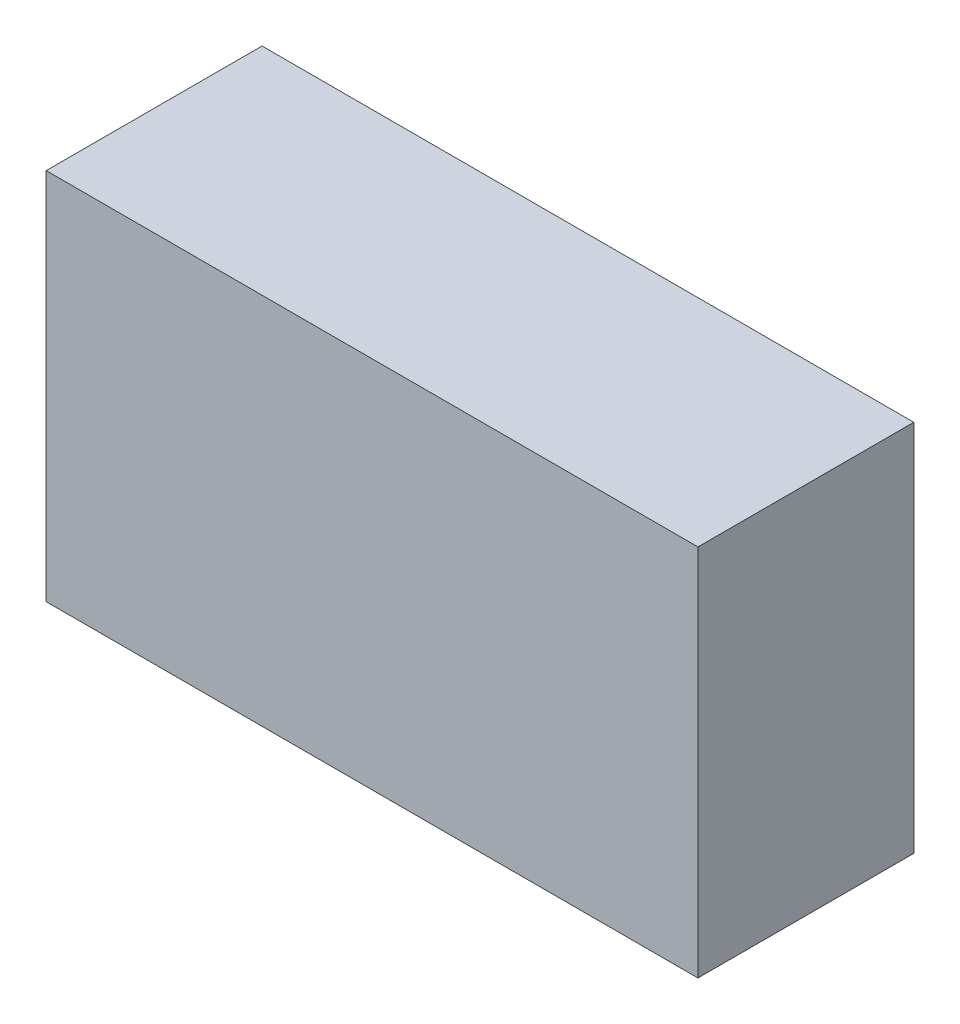
ISO-10303-21;
HEADER;
FILE_DESCRIPTION(('STEP AP214'),'2;1');
FILE_NAME('part.step','',(''),(''),'','','');
FILE_SCHEMA(('AUTOMOTIVE_DESIGN { 1 0 10303 214 1 1 1 1 }'));
ENDSEC;
DATA;
#1=APPLICATION_CONTEXT('core data for automotive mechanical design processes');
#2=APPLICATION_PROTOCOL_DEFINITION('international standard','automotive_design',2000,#1);
#3=PRODUCT_CONTEXT('',#1,'mechanical');
#4=PRODUCT('Part','Part','',(#3));
#5=PRODUCT_RELATED_PRODUCT_CATEGORY('part','',(#4));
#6=PRODUCT_DEFINITION_FORMATION('','',#4);
#7=PRODUCT_DEFINITION_CONTEXT('part definition',#1,'design');
#8=PRODUCT_DEFINITION('design','',#6,#7);
#9=PRODUCT_DEFINITION_SHAPE('','',#8);
#10=(LENGTH_UNIT() NAMED_UNIT(*) SI_UNIT(.MILLI.,.METRE.));
#11=(NAMED_UNIT(*) PLANE_ANGLE_UNIT() SI_UNIT($,.RADIAN.));
#12=(NAMED_UNIT(*) SI_UNIT($,.STERADIAN.) SOLID_ANGLE_UNIT());
#13=UNCERTAINTY_MEASURE_WITH_UNIT(LENGTH_MEASURE(1.E-05),#10,'distance_accuracy_value','');
#14=(GEOMETRIC_REPRESENTATION_CONTEXT(3) GLOBAL_UNCERTAINTY_ASSIGNED_CONTEXT((#13)) GLOBAL_UNIT_ASSIGNED_CONTEXT((#10,
#11,#12)) REPRESENTATION_CONTEXT('',''));
#15=CARTESIAN_POINT('',(0.,0.,0.));
#16=DIRECTION('',(0.,0.,1.));
#17=DIRECTION('',(1.,0.,0.));
#18=AXIS2_PLACEMENT_3D('',#15,#16,#17);
#19=CARTESIAN_POINT('',(57.1445000000004,30.19,7.25));
#20=DIRECTION('',(1.,0.,0.));
#21=DIRECTION('',(0.,0.,-1.));
#22=AXIS2_PLACEMENT_3D('',#19,#20,#21);
#23=PLANE('',#22);
#24=DIRECTION('',(0.,-1.,0.));
#25=VECTOR('',#24,1.);
#26=CARTESIAN_POINT('',(57.1445000000004,30.19,0.));
#27=LINE('',#26,#25);
#28=CARTESIAN_POINT('',(57.1445000000004,30.19,0.));
#29=VERTEX_POINT('',#28);
#30=CARTESIAN_POINT('',(57.1445000000004,17.65,0.));
#31=VERTEX_POINT('',#30);
#32=EDGE_CURVE('E128',#29,#31,#27,.T.);
#33=ORIENTED_EDGE('',*,*,#32,.T.);
#34=DIRECTION('',(0.,0.,-1.));
#35=VECTOR('',#34,1.);
#36=CARTESIAN_POINT('',(57.1445000000004,17.65,7.25));
#37=LINE('',#36,#35);
#38=CARTESIAN_POINT('',(57.1445000000004,17.65,7.25));
#39=VERTEX_POINT('',#38);
#40=EDGE_CURVE('E11',#39,#31,#37,.T.);
#41=ORIENTED_EDGE('',*,*,#40,.F.);
#42=DIRECTION('',(0.,-1.,0.));
#43=VECTOR('',#42,1.);
#44=CARTESIAN_POINT('',(57.1445000000004,30.19,7.25));
#45=LINE('',#44,#43);
#46=CARTESIAN_POINT('',(57.1445000000004,30.19,7.25));
#47=VERTEX_POINT('',#46);
#48=EDGE_CURVE('E148',#47,#39,#45,.T.);
#49=ORIENTED_EDGE('',*,*,#48,.F.);
#50=DIRECTION('',(0.,0.,-1.));
#51=VECTOR('',#50,1.);
#52=CARTESIAN_POINT('',(57.1445000000004,30.19,7.25));
#53=LINE('',#52,#51);
#54=EDGE_CURVE('E153',#47,#29,#53,.T.);
#55=ORIENTED_EDGE('',*,*,#54,.T.);
#56=EDGE_LOOP('',(#33,#41,#49,#55));
#57=FACE_BOUND('',#56,.T.);
#58=ADVANCED_FACE('F32',(#57),#23,.F.);
#59=CARTESIAN_POINT('',(57.1445000000004,17.65,7.25));
#60=DIRECTION('',(0.,1.,0.));
#61=DIRECTION('',(0.,0.,1.));
#62=AXIS2_PLACEMENT_3D('',#59,#60,#61);
#63=PLANE('',#62);
#64=DIRECTION('',(1.,0.,0.));
#65=VECTOR('',#64,1.);
#66=CARTESIAN_POINT('',(57.1445000000004,17.65,0.));
#67=LINE('',#66,#65);
#68=CARTESIAN_POINT('',(79.0368014902547,17.65,0.));
#69=VERTEX_POINT('',#68);
#70=EDGE_CURVE('E132',#31,#69,#67,.T.);
#71=ORIENTED_EDGE('',*,*,#70,.T.);
#72=DIRECTION('',(0.,0.,-1.));
#73=VECTOR('',#72,1.);
#74=CARTESIAN_POINT('',(79.0368014902547,17.65,7.25));
#75=LINE('',#74,#73);
#76=CARTESIAN_POINT('',(79.0368014902547,17.65,7.25));
#77=VERTEX_POINT('',#76);
#78=EDGE_CURVE('E39',#77,#69,#75,.T.);
#79=ORIENTED_EDGE('',*,*,#78,.F.);
#80=DIRECTION('',(1.,0.,0.));
#81=VECTOR('',#80,1.);
#82=CARTESIAN_POINT('',(57.1445000000004,17.65,7.25));
#83=LINE('',#82,#81);
#84=EDGE_CURVE('E83',#39,#77,#83,.T.);
#85=ORIENTED_EDGE('',*,*,#84,.F.);
#86=ORIENTED_EDGE('',*,*,#40,.T.);
#87=EDGE_LOOP('',(#71,#79,#85,#86));
#88=FACE_BOUND('',#87,.T.);
#89=ADVANCED_FACE('F182',(#88),#63,.F.);
#90=CARTESIAN_POINT('',(79.0368014902547,30.19,7.25));
#91=DIRECTION('',(-1.,0.,0.));
#92=DIRECTION('',(0.,0.,1.));
#93=AXIS2_PLACEMENT_3D('',#90,#91,#92);
#94=PLANE('',#93);
#95=DIRECTION('',(0.,1.,0.));
#96=VECTOR('',#95,1.);
#97=CARTESIAN_POINT('',(79.0368014902547,30.19,0.));
#98=LINE('',#97,#96);
#99=CARTESIAN_POINT('',(79.0368014902547,30.19,0.));
#100=VERTEX_POINT('',#99);
#101=EDGE_CURVE('E156',#69,#100,#98,.T.);
#102=ORIENTED_EDGE('',*,*,#101,.T.);
#103=DIRECTION('',(0.,0.,-1.));
#104=VECTOR('',#103,1.);
#105=CARTESIAN_POINT('',(79.0368014902547,30.19,7.25));
#106=LINE('',#105,#104);
#107=CARTESIAN_POINT('',(79.0368014902547,30.19,7.25));
#108=VERTEX_POINT('',#107);
#109=EDGE_CURVE('E160',#108,#100,#106,.T.);
#110=ORIENTED_EDGE('',*,*,#109,.F.);
#111=DIRECTION('',(0.,1.,0.));
#112=VECTOR('',#111,1.);
#113=CARTESIAN_POINT('',(79.0368014902547,30.19,7.25));
#114=LINE('',#113,#112);
#115=EDGE_CURVE('E151',#77,#108,#114,.T.);
#116=ORIENTED_EDGE('',*,*,#115,.F.);
#117=ORIENTED_EDGE('',*,*,#78,.T.);
#118=EDGE_LOOP('',(#102,#110,#116,#117));
#119=FACE_BOUND('',#118,.T.);
#120=ADVANCED_FACE('F165',(#119),#94,.F.);
#121=CARTESIAN_POINT('',(57.1445000000004,30.19,7.25));
#122=DIRECTION('',(0.,-1.,0.));
#123=DIRECTION('',(0.,0.,-1.));
#124=AXIS2_PLACEMENT_3D('',#121,#122,#123);
#125=PLANE('',#124);
#126=DIRECTION('',(-1.,0.,0.));
#127=VECTOR('',#126,1.);
#128=CARTESIAN_POINT('',(57.1445000000004,30.19,0.));
#129=LINE('',#128,#127);
#130=EDGE_CURVE('E76',#100,#29,#129,.T.);
#131=ORIENTED_EDGE('',*,*,#130,.T.);
#132=ORIENTED_EDGE('',*,*,#54,.F.);
#133=DIRECTION('',(-1.,0.,0.));
#134=VECTOR('',#133,1.);
#135=CARTESIAN_POINT('',(57.1445000000004,30.19,7.25));
#136=LINE('',#135,#134);
#137=EDGE_CURVE('E55',#108,#47,#136,.T.);
#138=ORIENTED_EDGE('',*,*,#137,.F.);
#139=ORIENTED_EDGE('',*,*,#109,.T.);
#140=EDGE_LOOP('',(#131,#132,#138,#139));
#141=FACE_BOUND('',#140,.T.);
#142=ADVANCED_FACE('F173',(#141),#125,.F.);
#143=CARTESIAN_POINT('',(0.,0.,7.25));
#144=DIRECTION('',(0.,0.,1.));
#145=DIRECTION('',(1.,0.,0.));
#146=AXIS2_PLACEMENT_3D('',#143,#144,#145);
#147=PLANE('',#146);
#148=ORIENTED_EDGE('',*,*,#48,.T.);
#149=ORIENTED_EDGE('',*,*,#84,.T.);
#150=ORIENTED_EDGE('',*,*,#115,.T.);
#151=ORIENTED_EDGE('',*,*,#137,.T.);
#152=EDGE_LOOP('',(#148,#149,#150,#151));
#153=FACE_BOUND('',#152,.T.);
#154=ADVANCED_FACE('F175',(#153),#147,.T.);
#155=CARTESIAN_POINT('',(0.,0.,0.));
#156=DIRECTION('',(0.,0.,1.));
#157=DIRECTION('',(1.,0.,0.));
#158=AXIS2_PLACEMENT_3D('',#155,#156,#157);
#159=PLANE('',#158);
#160=DIRECTION('',(-1.,0.,0.));
#161=VECTOR('',#160,1.);
#162=CARTESIAN_POINT('',(57.1445000000004,29.69,0.));
#163=LINE('',#162,#161);
#164=CARTESIAN_POINT('',(78.5368014902547,29.69,0.));
#165=VERTEX_POINT('',#164);
#166=CARTESIAN_POINT('',(57.6445000000004,29.69,0.));
#167=VERTEX_POINT('',#166);
#168=EDGE_CURVE('E123',#165,#167,#163,.T.);
#169=ORIENTED_EDGE('',*,*,#168,.T.);
#170=DIRECTION('',(0.,-1.,0.));
#171=VECTOR('',#170,1.);
#172=CARTESIAN_POINT('',(57.6445000000004,30.19,0.));
#173=LINE('',#172,#171);
#174=CARTESIAN_POINT('',(57.6445000000004,18.15,0.));
#175=VERTEX_POINT('',#174);
#176=EDGE_CURVE('E142',#167,#175,#173,.T.);
#177=ORIENTED_EDGE('',*,*,#176,.T.);
#178=DIRECTION('',(1.,0.,0.));
#179=VECTOR('',#178,1.);
#180=CARTESIAN_POINT('',(57.1445000000004,18.15,0.));
#181=LINE('',#180,#179);
#182=CARTESIAN_POINT('',(78.5368014902547,18.15,0.));
#183=VERTEX_POINT('',#182);
#184=EDGE_CURVE('E127',#175,#183,#181,.T.);
#185=ORIENTED_EDGE('',*,*,#184,.T.);
#186=DIRECTION('',(0.,1.,0.));
#187=VECTOR('',#186,1.);
#188=CARTESIAN_POINT('',(78.5368014902547,30.19,0.));
#189=LINE('',#188,#187);
#190=EDGE_CURVE('E46',#183,#165,#189,.T.);
#191=ORIENTED_EDGE('',*,*,#190,.T.);
#192=EDGE_LOOP('',(#169,#177,#185,#191));
#193=FACE_BOUND('',#192,.T.);
#194=ORIENTED_EDGE('',*,*,#32,.F.);
#195=ORIENTED_EDGE('',*,*,#130,.F.);
#196=ORIENTED_EDGE('',*,*,#101,.F.);
#197=ORIENTED_EDGE('',*,*,#70,.F.);
#198=EDGE_LOOP('',(#194,#195,#196,#197));
#199=FACE_BOUND('',#198,.T.);
#200=ADVANCED_FACE('F169',(#193,#199),#159,.F.);
#201=CARTESIAN_POINT('',(57.6445000000004,30.19,7.25));
#202=DIRECTION('',(1.,0.,0.));
#203=DIRECTION('',(0.,0.,-1.));
#204=AXIS2_PLACEMENT_3D('',#201,#202,#203);
#205=PLANE('',#204);
#206=ORIENTED_EDGE('',*,*,#176,.F.);
#207=DIRECTION('',(0.,0.,-1.));
#208=VECTOR('',#207,1.);
#209=CARTESIAN_POINT('',(57.6445000000004,29.69,7.25));
#210=LINE('',#209,#208);
#211=CARTESIAN_POINT('',(57.6445000000004,29.69,7.05));
#212=VERTEX_POINT('',#211);
#213=EDGE_CURVE('E122',#212,#167,#210,.T.);
#214=ORIENTED_EDGE('',*,*,#213,.F.);
#215=DIRECTION('',(0.,-1.,0.));
#216=VECTOR('',#215,1.);
#217=CARTESIAN_POINT('',(57.6445000000004,30.19,7.05));
#218=LINE('',#217,#216);
#219=CARTESIAN_POINT('',(57.6445000000004,18.15,7.05));
#220=VERTEX_POINT('',#219);
#221=EDGE_CURVE('E110',#212,#220,#218,.T.);
#222=ORIENTED_EDGE('',*,*,#221,.T.);
#223=DIRECTION('',(0.,0.,-1.));
#224=VECTOR('',#223,1.);
#225=CARTESIAN_POINT('',(57.6445000000004,18.15,7.25));
#226=LINE('',#225,#224);
#227=EDGE_CURVE('E120',#220,#175,#226,.T.);
#228=ORIENTED_EDGE('',*,*,#227,.T.);
#229=EDGE_LOOP('',(#206,#214,#222,#228));
#230=FACE_BOUND('',#229,.T.);
#231=ADVANCED_FACE('F119',(#230),#205,.T.);
#232=CARTESIAN_POINT('',(57.1445000000004,18.15,7.25));
#233=DIRECTION('',(0.,1.,0.));
#234=DIRECTION('',(0.,0.,1.));
#235=AXIS2_PLACEMENT_3D('',#232,#233,#234);
#236=PLANE('',#235);
#237=ORIENTED_EDGE('',*,*,#184,.F.);
#238=ORIENTED_EDGE('',*,*,#227,.F.);
#239=DIRECTION('',(1.,0.,0.));
#240=VECTOR('',#239,1.);
#241=CARTESIAN_POINT('',(57.1445000000004,18.15,7.05));
#242=LINE('',#241,#240);
#243=CARTESIAN_POINT('',(78.5368014902547,18.15,7.05));
#244=VERTEX_POINT('',#243);
#245=EDGE_CURVE('E106',#220,#244,#242,.T.);
#246=ORIENTED_EDGE('',*,*,#245,.T.);
#247=DIRECTION('',(0.,0.,-1.));
#248=VECTOR('',#247,1.);
#249=CARTESIAN_POINT('',(78.5368014902547,18.15,7.25));
#250=LINE('',#249,#248);
#251=EDGE_CURVE('E129',#244,#183,#250,.T.);
#252=ORIENTED_EDGE('',*,*,#251,.T.);
#253=EDGE_LOOP('',(#237,#238,#246,#252));
#254=FACE_BOUND('',#253,.T.);
#255=ADVANCED_FACE('F125',(#254),#236,.T.);
#256=CARTESIAN_POINT('',(78.5368014902547,30.19,7.25));
#257=DIRECTION('',(-1.,0.,0.));
#258=DIRECTION('',(0.,0.,1.));
#259=AXIS2_PLACEMENT_3D('',#256,#257,#258);
#260=PLANE('',#259);
#261=ORIENTED_EDGE('',*,*,#190,.F.);
#262=ORIENTED_EDGE('',*,*,#251,.F.);
#263=DIRECTION('',(0.,1.,0.));
#264=VECTOR('',#263,1.);
#265=CARTESIAN_POINT('',(78.5368014902547,30.19,7.05));
#266=LINE('',#265,#264);
#267=CARTESIAN_POINT('',(78.5368014902547,29.69,7.05));
#268=VERTEX_POINT('',#267);
#269=EDGE_CURVE('E111',#244,#268,#266,.T.);
#270=ORIENTED_EDGE('',*,*,#269,.T.);
#271=DIRECTION('',(0.,0.,-1.));
#272=VECTOR('',#271,1.);
#273=CARTESIAN_POINT('',(78.5368014902547,29.69,7.25));
#274=LINE('',#273,#272);
#275=EDGE_CURVE('E134',#268,#165,#274,.T.);
#276=ORIENTED_EDGE('',*,*,#275,.T.);
#277=EDGE_LOOP('',(#261,#262,#270,#276));
#278=FACE_BOUND('',#277,.T.);
#279=ADVANCED_FACE('F230',(#278),#260,.T.);
#280=CARTESIAN_POINT('',(57.1445000000004,29.69,7.25));
#281=DIRECTION('',(0.,-1.,0.));
#282=DIRECTION('',(0.,0.,-1.));
#283=AXIS2_PLACEMENT_3D('',#280,#281,#282);
#284=PLANE('',#283);
#285=ORIENTED_EDGE('',*,*,#168,.F.);
#286=ORIENTED_EDGE('',*,*,#275,.F.);
#287=DIRECTION('',(-1.,0.,0.));
#288=VECTOR('',#287,1.);
#289=CARTESIAN_POINT('',(57.1445000000004,29.69,7.05));
#290=LINE('',#289,#288);
#291=EDGE_CURVE('E137',#268,#212,#290,.T.);
#292=ORIENTED_EDGE('',*,*,#291,.T.);
#293=ORIENTED_EDGE('',*,*,#213,.T.);
#294=EDGE_LOOP('',(#285,#286,#292,#293));
#295=FACE_BOUND('',#294,.T.);
#296=ADVANCED_FACE('F239',(#295),#284,.T.);
#297=CARTESIAN_POINT('',(0.,0.,7.05));
#298=DIRECTION('',(0.,0.,1.));
#299=DIRECTION('',(1.,0.,0.));
#300=AXIS2_PLACEMENT_3D('',#297,#298,#299);
#301=PLANE('',#300);
#302=ORIENTED_EDGE('',*,*,#221,.F.);
#303=ORIENTED_EDGE('',*,*,#291,.F.);
#304=ORIENTED_EDGE('',*,*,#269,.F.);
#305=ORIENTED_EDGE('',*,*,#245,.F.);
#306=EDGE_LOOP('',(#302,#303,#304,#305));
#307=FACE_BOUND('',#306,.T.);
#308=ADVANCED_FACE('F108',(#307),#301,.F.);
#309=CLOSED_SHELL('',(#58,#89,#120,#142,#154,#200,#231,#255,#279,#296,#308));
#310=MANIFOLD_SOLID_BREP('B2',#309);
#311=ADVANCED_BREP_SHAPE_REPRESENTATION('',(#18,#310),#14);
#312=SHAPE_DEFINITION_REPRESENTATION(#9,#311);
ENDSEC;
END-ISO-10303-21;
